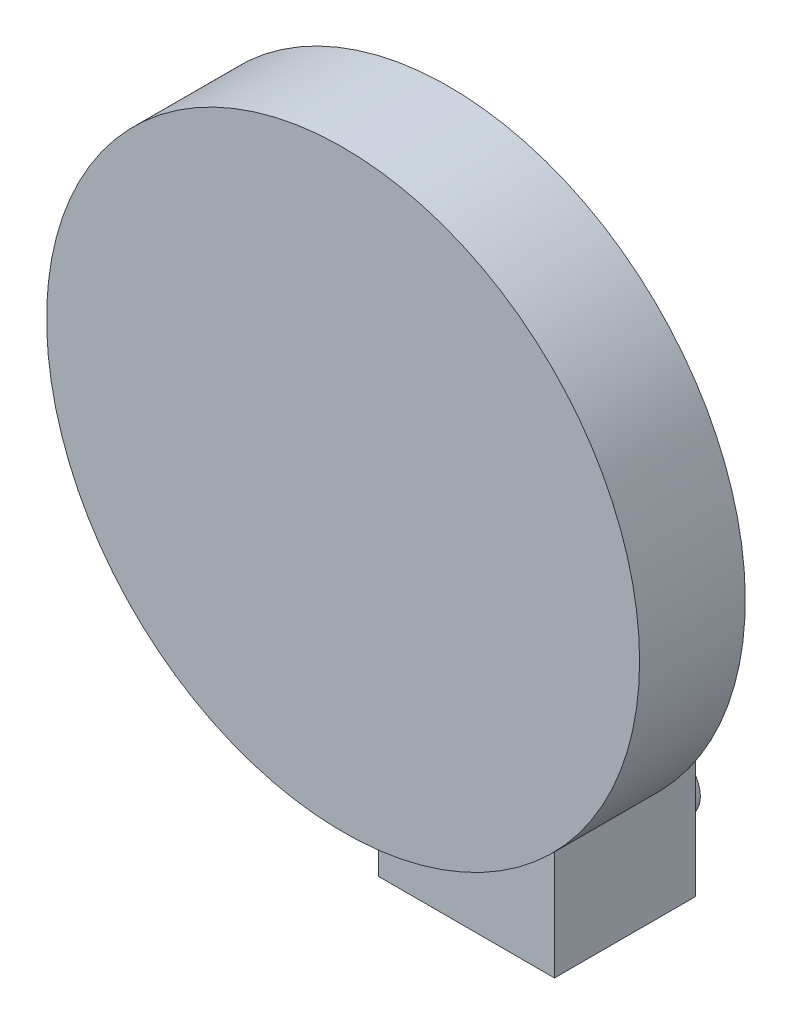
ISO-10303-21;
HEADER;
FILE_DESCRIPTION(('STEP AP214'),'2;1');
FILE_NAME('part.step','',(''),(''),'','','');
FILE_SCHEMA(('AUTOMOTIVE_DESIGN { 1 0 10303 214 1 1 1 1 }'));
ENDSEC;
DATA;
#1=APPLICATION_CONTEXT('core data for automotive mechanical design processes');
#2=APPLICATION_PROTOCOL_DEFINITION('international standard','automotive_design',2000,#1);
#3=PRODUCT_CONTEXT('',#1,'mechanical');
#4=PRODUCT('Part','Part','',(#3));
#5=PRODUCT_RELATED_PRODUCT_CATEGORY('part','',(#4));
#6=PRODUCT_DEFINITION_FORMATION('','',#4);
#7=PRODUCT_DEFINITION_CONTEXT('part definition',#1,'design');
#8=PRODUCT_DEFINITION('design','',#6,#7);
#9=PRODUCT_DEFINITION_SHAPE('','',#8);
#10=(LENGTH_UNIT() NAMED_UNIT(*) SI_UNIT(.MILLI.,.METRE.));
#11=(NAMED_UNIT(*) PLANE_ANGLE_UNIT() SI_UNIT($,.RADIAN.));
#12=(NAMED_UNIT(*) SI_UNIT($,.STERADIAN.) SOLID_ANGLE_UNIT());
#13=UNCERTAINTY_MEASURE_WITH_UNIT(LENGTH_MEASURE(1.E-05),#10,'distance_accuracy_value','');
#14=(GEOMETRIC_REPRESENTATION_CONTEXT(3) GLOBAL_UNCERTAINTY_ASSIGNED_CONTEXT((#13)) GLOBAL_UNIT_ASSIGNED_CONTEXT((#10,
#11,#12)) REPRESENTATION_CONTEXT('',''));
#15=CARTESIAN_POINT('',(0.,0.,0.));
#16=DIRECTION('',(0.,0.,1.));
#17=DIRECTION('',(1.,0.,0.));
#18=AXIS2_PLACEMENT_3D('',#15,#16,#17);
#19=CARTESIAN_POINT('',(0.,0.,15.));
#20=DIRECTION('',(0.,0.,-1.));
#21=DIRECTION('',(-1.,0.,0.));
#22=AXIS2_PLACEMENT_3D('',#19,#20,#21);
#23=CYLINDRICAL_SURFACE('',#22,42.075);
#24=CARTESIAN_POINT('',(0.,0.,15.));
#25=DIRECTION('',(0.,0.,1.));
#26=DIRECTION('',(1.,0.,0.));
#27=AXIS2_PLACEMENT_3D('',#24,#25,#26);
#28=CIRCLE('',#27,42.075);
#29=CARTESIAN_POINT('',(42.075,0.,15.));
#30=VERTEX_POINT('',#29);
#31=EDGE_CURVE('E52',#30,#30,#28,.T.);
#32=ORIENTED_EDGE('',*,*,#31,.F.);
#33=EDGE_LOOP('',(#32));
#34=FACE_BOUND('',#33,.T.);
#35=CARTESIAN_POINT('',(0.,0.,0.));
#36=DIRECTION('',(0.,0.,1.));
#37=DIRECTION('',(1.,0.,0.));
#38=AXIS2_PLACEMENT_3D('',#35,#36,#37);
#39=CIRCLE('',#38,42.075);
#40=CARTESIAN_POINT('',(-10.,-40.8693727013273,0.));
#41=VERTEX_POINT('',#40);
#42=CARTESIAN_POINT('',(15.,-39.3103755387811,0.));
#43=VERTEX_POINT('',#42);
#44=EDGE_CURVE('E46',#41,#43,#39,.T.);
#45=ORIENTED_EDGE('',*,*,#44,.T.);
#46=EDGE_CURVE('E101',#43,#41,#39,.T.);
#47=ORIENTED_EDGE('',*,*,#46,.T.);
#48=EDGE_LOOP('',(#45,#47));
#49=FACE_BOUND('',#48,.T.);
#50=ADVANCED_FACE('F43',(#34,#49),#23,.T.);
#51=CARTESIAN_POINT('',(0.,0.,15.));
#52=DIRECTION('',(0.,0.,1.));
#53=DIRECTION('',(1.,0.,0.));
#54=AXIS2_PLACEMENT_3D('',#51,#52,#53);
#55=PLANE('',#54);
#56=ORIENTED_EDGE('',*,*,#31,.T.);
#57=EDGE_LOOP('',(#56));
#58=FACE_BOUND('',#57,.T.);
#59=ADVANCED_FACE('F172',(#58),#55,.T.);
#60=CARTESIAN_POINT('',(0.,0.,0.));
#61=DIRECTION('',(0.,0.,1.));
#62=DIRECTION('',(1.,0.,0.));
#63=AXIS2_PLACEMENT_3D('',#60,#61,#62);
#64=PLANE('',#63);
#65=ORIENTED_EDGE('',*,*,#46,.F.);
#66=DIRECTION('',(0.,1.,0.));
#67=VECTOR('',#66,1.);
#68=CARTESIAN_POINT('',(15.,0.,0.));
#69=LINE('',#68,#67);
#70=CARTESIAN_POINT('',(15.,0.,0.));
#71=VERTEX_POINT('',#70);
#72=EDGE_CURVE('E11',#43,#71,#69,.T.);
#73=ORIENTED_EDGE('',*,*,#72,.T.);
#74=DIRECTION('',(-1.,0.,0.));
#75=VECTOR('',#74,1.);
#76=CARTESIAN_POINT('',(0.,0.,0.));
#77=LINE('',#76,#75);
#78=CARTESIAN_POINT('',(-10.,0.,0.));
#79=VERTEX_POINT('',#78);
#80=EDGE_CURVE('E113',#71,#79,#77,.T.);
#81=ORIENTED_EDGE('',*,*,#80,.T.);
#82=DIRECTION('',(0.,-1.,0.));
#83=VECTOR('',#82,1.);
#84=CARTESIAN_POINT('',(-10.,0.,0.));
#85=LINE('',#84,#83);
#86=EDGE_CURVE('E131',#79,#41,#85,.T.);
#87=ORIENTED_EDGE('',*,*,#86,.T.);
#88=EDGE_LOOP('',(#65,#73,#81,#87));
#89=FACE_BOUND('',#88,.T.);
#90=ADVANCED_FACE('F155',(#89),#64,.F.);
#91=CARTESIAN_POINT('',(15.,0.,-20.));
#92=DIRECTION('',(1.,0.,0.));
#93=DIRECTION('',(0.,0.,-1.));
#94=AXIS2_PLACEMENT_3D('',#91,#92,#93);
#95=PLANE('',#94);
#96=CARTESIAN_POINT('',(15.,-60.,0.));
#97=VERTEX_POINT('',#96);
#98=EDGE_CURVE('E54',#97,#43,#69,.T.);
#99=ORIENTED_EDGE('',*,*,#98,.F.);
#100=DIRECTION('',(0.,0.,1.));
#101=VECTOR('',#100,1.);
#102=CARTESIAN_POINT('',(15.,-60.,-20.));
#103=LINE('',#102,#101);
#104=CARTESIAN_POINT('',(15.,-60.,-20.));
#105=VERTEX_POINT('',#104);
#106=EDGE_CURVE('E91',#105,#97,#103,.T.);
#107=ORIENTED_EDGE('',*,*,#106,.F.);
#108=DIRECTION('',(0.,1.,0.));
#109=VECTOR('',#108,1.);
#110=CARTESIAN_POINT('',(15.,0.,-20.));
#111=LINE('',#110,#109);
#112=CARTESIAN_POINT('',(15.,0.,-20.));
#113=VERTEX_POINT('',#112);
#114=EDGE_CURVE('E94',#105,#113,#111,.T.);
#115=ORIENTED_EDGE('',*,*,#114,.T.);
#116=DIRECTION('',(0.,0.,1.));
#117=VECTOR('',#116,1.);
#118=CARTESIAN_POINT('',(15.,0.,-20.));
#119=LINE('',#118,#117);
#120=EDGE_CURVE('E124',#113,#71,#119,.T.);
#121=ORIENTED_EDGE('',*,*,#120,.T.);
#122=ORIENTED_EDGE('',*,*,#72,.F.);
#123=EDGE_LOOP('',(#99,#107,#115,#121,#122));
#124=FACE_BOUND('',#123,.T.);
#125=ADVANCED_FACE('F93',(#124),#95,.T.);
#126=CARTESIAN_POINT('',(0.,-60.,-20.));
#127=DIRECTION('',(0.,-1.,0.));
#128=DIRECTION('',(0.,0.,-1.));
#129=AXIS2_PLACEMENT_3D('',#126,#127,#128);
#130=PLANE('',#129);
#131=DIRECTION('',(1.,0.,0.));
#132=VECTOR('',#131,1.);
#133=CARTESIAN_POINT('',(0.,-60.,0.));
#134=LINE('',#133,#132);
#135=CARTESIAN_POINT('',(-10.,-60.,0.));
#136=VERTEX_POINT('',#135);
#137=EDGE_CURVE('E127',#136,#97,#134,.T.);
#138=ORIENTED_EDGE('',*,*,#137,.F.);
#139=DIRECTION('',(0.,0.,1.));
#140=VECTOR('',#139,1.);
#141=CARTESIAN_POINT('',(-10.,-60.,-20.));
#142=LINE('',#141,#140);
#143=CARTESIAN_POINT('',(-10.,-60.,-20.));
#144=VERTEX_POINT('',#143);
#145=EDGE_CURVE('E102',#144,#136,#142,.T.);
#146=ORIENTED_EDGE('',*,*,#145,.F.);
#147=DIRECTION('',(1.,0.,0.));
#148=VECTOR('',#147,1.);
#149=CARTESIAN_POINT('',(0.,-60.,-20.));
#150=LINE('',#149,#148);
#151=EDGE_CURVE('E108',#144,#105,#150,.T.);
#152=ORIENTED_EDGE('',*,*,#151,.T.);
#153=ORIENTED_EDGE('',*,*,#106,.T.);
#154=EDGE_LOOP('',(#138,#146,#152,#153));
#155=FACE_BOUND('',#154,.T.);
#156=ADVANCED_FACE('F115',(#155),#130,.T.);
#157=CARTESIAN_POINT('',(-10.,0.,-20.));
#158=DIRECTION('',(-1.,0.,0.));
#159=DIRECTION('',(0.,-1.,0.));
#160=AXIS2_PLACEMENT_3D('',#157,#158,#159);
#161=PLANE('',#160);
#162=ORIENTED_EDGE('',*,*,#86,.F.);
#163=DIRECTION('',(0.,0.,1.));
#164=VECTOR('',#163,1.);
#165=CARTESIAN_POINT('',(-10.,0.,-20.));
#166=LINE('',#165,#164);
#167=CARTESIAN_POINT('',(-10.,0.,-20.));
#168=VERTEX_POINT('',#167);
#169=EDGE_CURVE('E140',#168,#79,#166,.T.);
#170=ORIENTED_EDGE('',*,*,#169,.F.);
#171=DIRECTION('',(0.,-1.,0.));
#172=VECTOR('',#171,1.);
#173=CARTESIAN_POINT('',(-10.,0.,-20.));
#174=LINE('',#173,#172);
#175=EDGE_CURVE('E117',#168,#144,#174,.T.);
#176=ORIENTED_EDGE('',*,*,#175,.T.);
#177=ORIENTED_EDGE('',*,*,#145,.T.);
#178=EDGE_CURVE('E61',#41,#136,#85,.T.);
#179=ORIENTED_EDGE('',*,*,#178,.F.);
#180=EDGE_LOOP('',(#162,#170,#176,#177,#179));
#181=FACE_BOUND('',#180,.T.);
#182=ADVANCED_FACE('F157',(#181),#161,.T.);
#183=CARTESIAN_POINT('',(0.,0.,-20.));
#184=DIRECTION('',(0.,1.,0.));
#185=DIRECTION('',(-1.,0.,0.));
#186=AXIS2_PLACEMENT_3D('',#183,#184,#185);
#187=PLANE('',#186);
#188=ORIENTED_EDGE('',*,*,#80,.F.);
#189=ORIENTED_EDGE('',*,*,#120,.F.);
#190=DIRECTION('',(-1.,0.,0.));
#191=VECTOR('',#190,1.);
#192=CARTESIAN_POINT('',(0.,0.,-20.));
#193=LINE('',#192,#191);
#194=EDGE_CURVE('E111',#113,#168,#193,.T.);
#195=ORIENTED_EDGE('',*,*,#194,.T.);
#196=ORIENTED_EDGE('',*,*,#169,.T.);
#197=EDGE_LOOP('',(#188,#189,#195,#196));
#198=FACE_BOUND('',#197,.T.);
#199=ADVANCED_FACE('F159',(#198),#187,.T.);
#200=CARTESIAN_POINT('',(0.,0.,-20.));
#201=DIRECTION('',(0.,0.,-1.));
#202=DIRECTION('',(-1.,0.,0.));
#203=AXIS2_PLACEMENT_3D('',#200,#201,#202);
#204=PLANE('',#203);
#205=CARTESIAN_POINT('',(3.69323871979077,-55.3311615550314,-20.));
#206=DIRECTION('',(0.,0.,-1.));
#207=DIRECTION('',(-1.,0.,0.));
#208=AXIS2_PLACEMENT_3D('',#205,#206,#207);
#209=CIRCLE('',#208,4.);
#210=CARTESIAN_POINT('',(-0.306761280209231,-55.3311615550314,-20.));
#211=VERTEX_POINT('',#210);
#212=EDGE_CURVE('E241',#211,#211,#209,.T.);
#213=ORIENTED_EDGE('',*,*,#212,.F.);
#214=EDGE_LOOP('',(#213));
#215=FACE_BOUND('',#214,.T.);
#216=ORIENTED_EDGE('',*,*,#114,.F.);
#217=ORIENTED_EDGE('',*,*,#151,.F.);
#218=ORIENTED_EDGE('',*,*,#175,.F.);
#219=ORIENTED_EDGE('',*,*,#194,.F.);
#220=EDGE_LOOP('',(#216,#217,#218,#219));
#221=FACE_BOUND('',#220,.T.);
#222=ADVANCED_FACE('F106',(#215,#221),#204,.T.);
#223=CARTESIAN_POINT('',(0.,0.,0.));
#224=DIRECTION('',(0.,0.,-1.));
#225=DIRECTION('',(-1.,0.,0.));
#226=AXIS2_PLACEMENT_3D('',#223,#224,#225);
#227=PLANE('',#226);
#228=ORIENTED_EDGE('',*,*,#44,.F.);
#229=ORIENTED_EDGE('',*,*,#178,.T.);
#230=ORIENTED_EDGE('',*,*,#137,.T.);
#231=ORIENTED_EDGE('',*,*,#98,.T.);
#232=EDGE_LOOP('',(#228,#229,#230,#231));
#233=FACE_BOUND('',#232,.T.);
#234=ADVANCED_FACE('F166',(#233),#227,.F.);
#235=CARTESIAN_POINT('',(3.69323871979077,-55.3311615550314,-28.));
#236=DIRECTION('',(0.,0.,1.));
#237=DIRECTION('',(1.,0.,0.));
#238=AXIS2_PLACEMENT_3D('',#235,#236,#237);
#239=CYLINDRICAL_SURFACE('',#238,4.);
#240=CARTESIAN_POINT('',(3.69323871979077,-55.3311615550314,-28.));
#241=DIRECTION('',(0.,0.,-1.));
#242=DIRECTION('',(-1.,0.,0.));
#243=AXIS2_PLACEMENT_3D('',#240,#241,#242);
#244=CIRCLE('',#243,4.);
#245=CARTESIAN_POINT('',(-0.306761280209231,-55.3311615550314,-28.));
#246=VERTEX_POINT('',#245);
#247=EDGE_CURVE('E128',#246,#246,#244,.T.);
#248=ORIENTED_EDGE('',*,*,#247,.F.);
#249=EDGE_LOOP('',(#248));
#250=FACE_BOUND('',#249,.T.);
#251=ORIENTED_EDGE('',*,*,#212,.T.);
#252=EDGE_LOOP('',(#251));
#253=FACE_BOUND('',#252,.T.);
#254=ADVANCED_FACE('F208',(#250,#253),#239,.T.);
#255=CARTESIAN_POINT('',(3.69323871979077,-55.3311615550314,-28.));
#256=DIRECTION('',(0.,0.,-1.));
#257=DIRECTION('',(-1.,0.,0.));
#258=AXIS2_PLACEMENT_3D('',#255,#256,#257);
#259=PLANE('',#258);
#260=ORIENTED_EDGE('',*,*,#247,.T.);
#261=EDGE_LOOP('',(#260));
#262=FACE_BOUND('',#261,.T.);
#263=ADVANCED_FACE('F224',(#262),#259,.T.);
#264=CLOSED_SHELL('',(#50,#59,#90,#125,#156,#182,#199,#222,#234,#254,#263));
#265=MANIFOLD_SOLID_BREP('B2',#264);
#266=ADVANCED_BREP_SHAPE_REPRESENTATION('',(#18,#265),#14);
#267=SHAPE_DEFINITION_REPRESENTATION(#9,#266);
ENDSEC;
END-ISO-10303-21;
